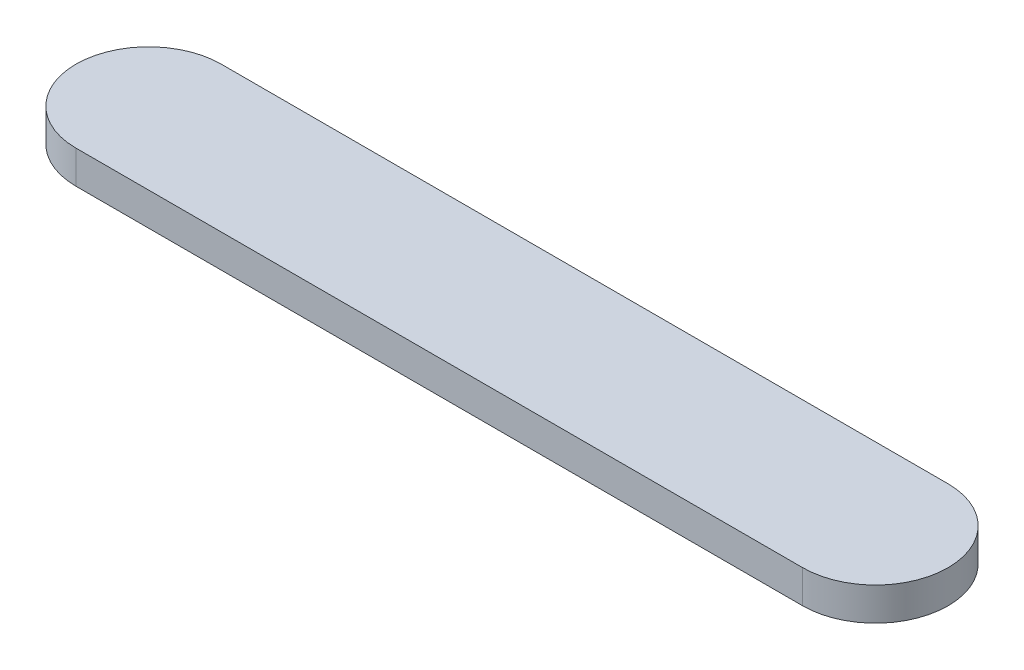
ISO-10303-21;
HEADER;
FILE_DESCRIPTION(('STEP AP214'),'2;1');
FILE_NAME('part.step','',(''),(''),'','','');
FILE_SCHEMA(('AUTOMOTIVE_DESIGN { 1 0 10303 214 1 1 1 1 }'));
ENDSEC;
DATA;
#1=APPLICATION_CONTEXT('core data for automotive mechanical design processes');
#2=APPLICATION_PROTOCOL_DEFINITION('international standard','automotive_design',2000,#1);
#3=PRODUCT_CONTEXT('',#1,'mechanical');
#4=PRODUCT('Part','Part','',(#3));
#5=PRODUCT_RELATED_PRODUCT_CATEGORY('part','',(#4));
#6=PRODUCT_DEFINITION_FORMATION('','',#4);
#7=PRODUCT_DEFINITION_CONTEXT('part definition',#1,'design');
#8=PRODUCT_DEFINITION('design','',#6,#7);
#9=PRODUCT_DEFINITION_SHAPE('','',#8);
#10=(LENGTH_UNIT() NAMED_UNIT(*) SI_UNIT(.MILLI.,.METRE.));
#11=(NAMED_UNIT(*) PLANE_ANGLE_UNIT() SI_UNIT($,.RADIAN.));
#12=(NAMED_UNIT(*) SI_UNIT($,.STERADIAN.) SOLID_ANGLE_UNIT());
#13=UNCERTAINTY_MEASURE_WITH_UNIT(LENGTH_MEASURE(1.E-05),#10,'distance_accuracy_value','');
#14=(GEOMETRIC_REPRESENTATION_CONTEXT(3) GLOBAL_UNCERTAINTY_ASSIGNED_CONTEXT((#13)) GLOBAL_UNIT_ASSIGNED_CONTEXT((#10,
#11,#12)) REPRESENTATION_CONTEXT('',''));
#15=CARTESIAN_POINT('',(0.,0.,0.));
#16=DIRECTION('',(0.,0.,1.));
#17=DIRECTION('',(1.,0.,0.));
#18=AXIS2_PLACEMENT_3D('',#15,#16,#17);
#19=CARTESIAN_POINT('',(0.,5.,0.));
#20=DIRECTION('',(0.,-1.,0.));
#21=DIRECTION('',(0.,0.,-1.));
#22=AXIS2_PLACEMENT_3D('',#19,#20,#21);
#23=CYLINDRICAL_SURFACE('',#22,11.);
#24=CARTESIAN_POINT('',(0.,0.,0.));
#25=DIRECTION('',(0.,1.,0.));
#26=DIRECTION('',(0.,0.,1.));
#27=AXIS2_PLACEMENT_3D('',#24,#25,#26);
#28=CIRCLE('',#27,11.);
#29=CARTESIAN_POINT('',(0.,0.,-11.));
#30=VERTEX_POINT('',#29);
#31=CARTESIAN_POINT('',(0.,0.,11.));
#32=VERTEX_POINT('',#31);
#33=EDGE_CURVE('E95',#30,#32,#28,.T.);
#34=ORIENTED_EDGE('',*,*,#33,.T.);
#35=DIRECTION('',(0.,-1.,0.));
#36=VECTOR('',#35,1.);
#37=CARTESIAN_POINT('',(0.,5.,11.));
#38=LINE('',#37,#36);
#39=CARTESIAN_POINT('',(0.,5.,11.));
#40=VERTEX_POINT('',#39);
#41=EDGE_CURVE('E11',#40,#32,#38,.T.);
#42=ORIENTED_EDGE('',*,*,#41,.F.);
#43=CARTESIAN_POINT('',(0.,5.,0.));
#44=DIRECTION('',(0.,1.,0.));
#45=DIRECTION('',(0.,0.,1.));
#46=AXIS2_PLACEMENT_3D('',#43,#44,#45);
#47=CIRCLE('',#46,11.);
#48=CARTESIAN_POINT('',(0.,5.,-11.));
#49=VERTEX_POINT('',#48);
#50=EDGE_CURVE('E83',#49,#40,#47,.T.);
#51=ORIENTED_EDGE('',*,*,#50,.F.);
#52=DIRECTION('',(0.,-1.,0.));
#53=VECTOR('',#52,1.);
#54=CARTESIAN_POINT('',(0.,5.,-11.));
#55=LINE('',#54,#53);
#56=EDGE_CURVE('E91',#49,#30,#55,.T.);
#57=ORIENTED_EDGE('',*,*,#56,.T.);
#58=EDGE_LOOP('',(#34,#42,#51,#57));
#59=FACE_BOUND('',#58,.T.);
#60=ADVANCED_FACE('F32',(#59),#23,.T.);
#61=CARTESIAN_POINT('',(0.,5.,11.));
#62=DIRECTION('',(0.,0.,-1.));
#63=DIRECTION('',(-1.,0.,0.));
#64=AXIS2_PLACEMENT_3D('',#61,#62,#63);
#65=PLANE('',#64);
#66=DIRECTION('',(1.,0.,0.));
#67=VECTOR('',#66,1.);
#68=CARTESIAN_POINT('',(0.,0.,11.));
#69=LINE('',#68,#67);
#70=CARTESIAN_POINT('',(110.,0.,11.));
#71=VERTEX_POINT('',#70);
#72=EDGE_CURVE('E87',#32,#71,#69,.T.);
#73=ORIENTED_EDGE('',*,*,#72,.T.);
#74=DIRECTION('',(0.,-1.,0.));
#75=VECTOR('',#74,1.);
#76=CARTESIAN_POINT('',(110.,5.,11.));
#77=LINE('',#76,#75);
#78=CARTESIAN_POINT('',(110.,5.,11.));
#79=VERTEX_POINT('',#78);
#80=EDGE_CURVE('E40',#79,#71,#77,.T.);
#81=ORIENTED_EDGE('',*,*,#80,.F.);
#82=DIRECTION('',(1.,0.,0.));
#83=VECTOR('',#82,1.);
#84=CARTESIAN_POINT('',(0.,5.,11.));
#85=LINE('',#84,#83);
#86=EDGE_CURVE('E78',#40,#79,#85,.T.);
#87=ORIENTED_EDGE('',*,*,#86,.F.);
#88=ORIENTED_EDGE('',*,*,#41,.T.);
#89=EDGE_LOOP('',(#73,#81,#87,#88));
#90=FACE_BOUND('',#89,.T.);
#91=ADVANCED_FACE('F86',(#90),#65,.F.);
#92=CARTESIAN_POINT('',(110.,5.,0.));
#93=DIRECTION('',(0.,-1.,0.));
#94=DIRECTION('',(0.,0.,-1.));
#95=AXIS2_PLACEMENT_3D('',#92,#93,#94);
#96=CYLINDRICAL_SURFACE('',#95,11.);
#97=CARTESIAN_POINT('',(110.,0.,0.));
#98=DIRECTION('',(0.,1.,0.));
#99=DIRECTION('',(0.,0.,1.));
#100=AXIS2_PLACEMENT_3D('',#97,#98,#99);
#101=CIRCLE('',#100,11.);
#102=CARTESIAN_POINT('',(110.,0.,-11.));
#103=VERTEX_POINT('',#102);
#104=EDGE_CURVE('E65',#71,#103,#101,.T.);
#105=ORIENTED_EDGE('',*,*,#104,.T.);
#106=DIRECTION('',(0.,-1.,0.));
#107=VECTOR('',#106,1.);
#108=CARTESIAN_POINT('',(110.,5.,-11.));
#109=LINE('',#108,#107);
#110=CARTESIAN_POINT('',(110.,5.,-11.));
#111=VERTEX_POINT('',#110);
#112=EDGE_CURVE('E88',#111,#103,#109,.T.);
#113=ORIENTED_EDGE('',*,*,#112,.F.);
#114=CARTESIAN_POINT('',(110.,5.,0.));
#115=DIRECTION('',(0.,1.,0.));
#116=DIRECTION('',(0.,0.,1.));
#117=AXIS2_PLACEMENT_3D('',#114,#115,#116);
#118=CIRCLE('',#117,11.);
#119=EDGE_CURVE('E81',#79,#111,#118,.T.);
#120=ORIENTED_EDGE('',*,*,#119,.F.);
#121=ORIENTED_EDGE('',*,*,#80,.T.);
#122=EDGE_LOOP('',(#105,#113,#120,#121));
#123=FACE_BOUND('',#122,.T.);
#124=ADVANCED_FACE('F89',(#123),#96,.T.);
#125=CARTESIAN_POINT('',(0.,5.,-11.));
#126=DIRECTION('',(0.,0.,1.));
#127=DIRECTION('',(1.,0.,0.));
#128=AXIS2_PLACEMENT_3D('',#125,#126,#127);
#129=PLANE('',#128);
#130=DIRECTION('',(-1.,0.,0.));
#131=VECTOR('',#130,1.);
#132=CARTESIAN_POINT('',(0.,0.,-11.));
#133=LINE('',#132,#131);
#134=EDGE_CURVE('E71',#103,#30,#133,.T.);
#135=ORIENTED_EDGE('',*,*,#134,.T.);
#136=ORIENTED_EDGE('',*,*,#56,.F.);
#137=DIRECTION('',(-1.,0.,0.));
#138=VECTOR('',#137,1.);
#139=CARTESIAN_POINT('',(0.,5.,-11.));
#140=LINE('',#139,#138);
#141=EDGE_CURVE('E48',#111,#49,#140,.T.);
#142=ORIENTED_EDGE('',*,*,#141,.F.);
#143=ORIENTED_EDGE('',*,*,#112,.T.);
#144=EDGE_LOOP('',(#135,#136,#142,#143));
#145=FACE_BOUND('',#144,.T.);
#146=ADVANCED_FACE('F102',(#145),#129,.F.);
#147=CARTESIAN_POINT('',(0.,5.,0.));
#148=DIRECTION('',(0.,1.,0.));
#149=DIRECTION('',(0.,0.,1.));
#150=AXIS2_PLACEMENT_3D('',#147,#148,#149);
#151=PLANE('',#150);
#152=ORIENTED_EDGE('',*,*,#50,.T.);
#153=ORIENTED_EDGE('',*,*,#86,.T.);
#154=ORIENTED_EDGE('',*,*,#119,.T.);
#155=ORIENTED_EDGE('',*,*,#141,.T.);
#156=EDGE_LOOP('',(#152,#153,#154,#155));
#157=FACE_BOUND('',#156,.T.);
#158=ADVANCED_FACE('F79',(#157),#151,.T.);
#159=CARTESIAN_POINT('',(0.,0.,0.));
#160=DIRECTION('',(0.,1.,0.));
#161=DIRECTION('',(0.,0.,1.));
#162=AXIS2_PLACEMENT_3D('',#159,#160,#161);
#163=PLANE('',#162);
#164=ORIENTED_EDGE('',*,*,#33,.F.);
#165=ORIENTED_EDGE('',*,*,#134,.F.);
#166=ORIENTED_EDGE('',*,*,#104,.F.);
#167=ORIENTED_EDGE('',*,*,#72,.F.);
#168=EDGE_LOOP('',(#164,#165,#166,#167));
#169=FACE_BOUND('',#168,.T.);
#170=ADVANCED_FACE('F105',(#169),#163,.F.);
#171=CLOSED_SHELL('',(#60,#91,#124,#146,#158,#170));
#172=MANIFOLD_SOLID_BREP('B2',#171);
#173=ADVANCED_BREP_SHAPE_REPRESENTATION('',(#18,#172),#14);
#174=SHAPE_DEFINITION_REPRESENTATION(#9,#173);
ENDSEC;
END-ISO-10303-21;
